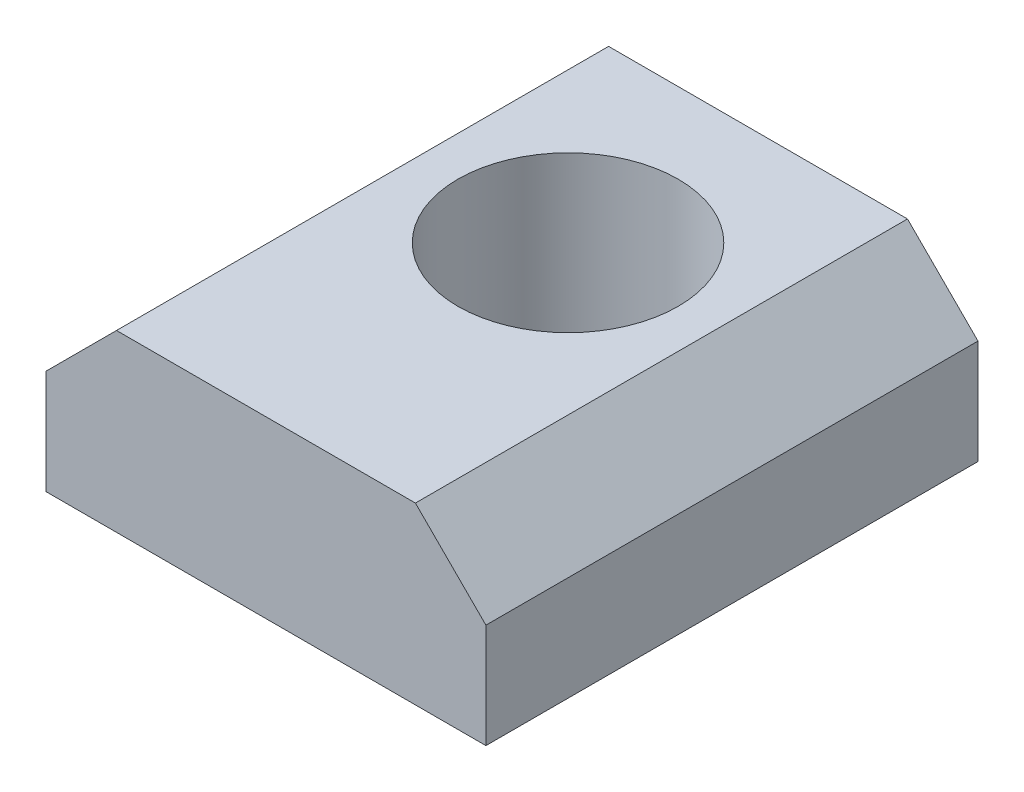
ISO-10303-21;
HEADER;
FILE_DESCRIPTION(('STEP AP214'),'2;1');
FILE_NAME('part.step','',(''),(''),'','','');
FILE_SCHEMA(('AUTOMOTIVE_DESIGN { 1 0 10303 214 1 1 1 1 }'));
ENDSEC;
DATA;
#1=APPLICATION_CONTEXT('core data for automotive mechanical design processes');
#2=APPLICATION_PROTOCOL_DEFINITION('international standard','automotive_design',2000,#1);
#3=PRODUCT_CONTEXT('',#1,'mechanical');
#4=PRODUCT('Part','Part','',(#3));
#5=PRODUCT_RELATED_PRODUCT_CATEGORY('part','',(#4));
#6=PRODUCT_DEFINITION_FORMATION('','',#4);
#7=PRODUCT_DEFINITION_CONTEXT('part definition',#1,'design');
#8=PRODUCT_DEFINITION('design','',#6,#7);
#9=PRODUCT_DEFINITION_SHAPE('','',#8);
#10=(LENGTH_UNIT() NAMED_UNIT(*) SI_UNIT(.MILLI.,.METRE.));
#11=(NAMED_UNIT(*) PLANE_ANGLE_UNIT() SI_UNIT($,.RADIAN.));
#12=(NAMED_UNIT(*) SI_UNIT($,.STERADIAN.) SOLID_ANGLE_UNIT());
#13=UNCERTAINTY_MEASURE_WITH_UNIT(LENGTH_MEASURE(1.E-05),#10,'distance_accuracy_value','');
#14=(GEOMETRIC_REPRESENTATION_CONTEXT(3) GLOBAL_UNCERTAINTY_ASSIGNED_CONTEXT((#13)) GLOBAL_UNIT_ASSIGNED_CONTEXT((#10,
#11,#12)) REPRESENTATION_CONTEXT('',''));
#15=CARTESIAN_POINT('',(0.,0.,0.));
#16=DIRECTION('',(0.,0.,1.));
#17=DIRECTION('',(1.,0.,0.));
#18=AXIS2_PLACEMENT_3D('',#15,#16,#17);
#19=CARTESIAN_POINT('',(0.,0.,-17.7292));
#20=DIRECTION('',(0.,-1.,0.));
#21=DIRECTION('',(0.,0.,-1.));
#22=AXIS2_PLACEMENT_3D('',#19,#20,#21);
#23=PLANE('',#22);
#24=CARTESIAN_POINT('',(7.9375,0.,-10.8712));
#25=DIRECTION('',(0.,-1.,0.));
#26=DIRECTION('',(0.,0.,-1.));
#27=AXIS2_PLACEMENT_3D('',#24,#25,#26);
#28=CIRCLE('',#27,3.96875);
#29=CARTESIAN_POINT('',(7.9375,0.,-14.83995));
#30=VERTEX_POINT('',#29);
#31=EDGE_CURVE('E90',#30,#30,#28,.T.);
#32=ORIENTED_EDGE('',*,*,#31,.F.);
#33=EDGE_LOOP('',(#32));
#34=FACE_BOUND('',#33,.T.);
#35=DIRECTION('',(1.,0.,0.));
#36=VECTOR('',#35,1.);
#37=CARTESIAN_POINT('',(0.,0.,0.));
#38=LINE('',#37,#36);
#39=CARTESIAN_POINT('',(0.,0.,0.));
#40=VERTEX_POINT('',#39);
#41=CARTESIAN_POINT('',(15.8496,0.,0.));
#42=VERTEX_POINT('',#41);
#43=EDGE_CURVE('E87',#40,#42,#38,.T.);
#44=ORIENTED_EDGE('',*,*,#43,.F.);
#45=DIRECTION('',(0.,0.,1.));
#46=VECTOR('',#45,1.);
#47=CARTESIAN_POINT('',(0.,0.,-17.7292));
#48=LINE('',#47,#46);
#49=CARTESIAN_POINT('',(0.,0.,-17.7292));
#50=VERTEX_POINT('',#49);
#51=EDGE_CURVE('E93',#50,#40,#48,.T.);
#52=ORIENTED_EDGE('',*,*,#51,.F.);
#53=DIRECTION('',(1.,0.,0.));
#54=VECTOR('',#53,1.);
#55=CARTESIAN_POINT('',(0.,0.,-17.7292));
#56=LINE('',#55,#54);
#57=CARTESIAN_POINT('',(15.8496,0.,-17.7292));
#58=VERTEX_POINT('',#57);
#59=EDGE_CURVE('E110',#50,#58,#56,.T.);
#60=ORIENTED_EDGE('',*,*,#59,.T.);
#61=DIRECTION('',(0.,0.,1.));
#62=VECTOR('',#61,1.);
#63=CARTESIAN_POINT('',(15.8496,0.,-17.7292));
#64=LINE('',#63,#62);
#65=EDGE_CURVE('E98',#58,#42,#64,.T.);
#66=ORIENTED_EDGE('',*,*,#65,.T.);
#67=EDGE_LOOP('',(#44,#52,#60,#66));
#68=FACE_BOUND('',#67,.T.);
#69=ADVANCED_FACE('F30',(#34,#68),#23,.T.);
#70=CARTESIAN_POINT('',(0.,0.,-17.7292));
#71=DIRECTION('',(-1.,0.,0.));
#72=DIRECTION('',(0.,0.,1.));
#73=AXIS2_PLACEMENT_3D('',#70,#71,#72);
#74=PLANE('',#73);
#75=DIRECTION('',(0.,-1.,0.));
#76=VECTOR('',#75,1.);
#77=CARTESIAN_POINT('',(0.,0.,0.));
#78=LINE('',#77,#76);
#79=CARTESIAN_POINT('',(0.,3.75919999999999,0.));
#80=VERTEX_POINT('',#79);
#81=EDGE_CURVE('E82',#80,#40,#78,.T.);
#82=ORIENTED_EDGE('',*,*,#81,.F.);
#83=DIRECTION('',(0.,0.,-1.));
#84=VECTOR('',#83,1.);
#85=CARTESIAN_POINT('',(0.,3.75919999999999,-17.7292));
#86=LINE('',#85,#84);
#87=CARTESIAN_POINT('',(0.,3.75919999999999,-17.7292));
#88=VERTEX_POINT('',#87);
#89=EDGE_CURVE('E11',#80,#88,#86,.T.);
#90=ORIENTED_EDGE('',*,*,#89,.T.);
#91=DIRECTION('',(0.,-1.,0.));
#92=VECTOR('',#91,1.);
#93=CARTESIAN_POINT('',(0.,0.,-17.7292));
#94=LINE('',#93,#92);
#95=EDGE_CURVE('E94',#88,#50,#94,.T.);
#96=ORIENTED_EDGE('',*,*,#95,.T.);
#97=ORIENTED_EDGE('',*,*,#51,.T.);
#98=EDGE_LOOP('',(#82,#90,#96,#97));
#99=FACE_BOUND('',#98,.T.);
#100=ADVANCED_FACE('F32',(#99),#74,.T.);
#101=CARTESIAN_POINT('',(0.,6.2992,-17.7292));
#102=DIRECTION('',(0.,1.,0.));
#103=DIRECTION('',(0.,0.,1.));
#104=AXIS2_PLACEMENT_3D('',#101,#102,#103);
#105=PLANE('',#104);
#106=CARTESIAN_POINT('',(7.9375,6.2992,-10.8712));
#107=DIRECTION('',(0.,1.,0.));
#108=DIRECTION('',(0.,0.,1.));
#109=AXIS2_PLACEMENT_3D('',#106,#107,#108);
#110=CIRCLE('',#109,3.96875);
#111=CARTESIAN_POINT('',(7.9375,6.2992,-6.90245));
#112=VERTEX_POINT('',#111);
#113=EDGE_CURVE('E120',#112,#112,#110,.T.);
#114=ORIENTED_EDGE('',*,*,#113,.F.);
#115=EDGE_LOOP('',(#114));
#116=FACE_BOUND('',#115,.T.);
#117=DIRECTION('',(-1.,0.,0.));
#118=VECTOR('',#117,1.);
#119=CARTESIAN_POINT('',(0.,6.2992,0.));
#120=LINE('',#119,#118);
#121=CARTESIAN_POINT('',(13.3096,6.2992,0.));
#122=VERTEX_POINT('',#121);
#123=CARTESIAN_POINT('',(2.54,6.2992,0.));
#124=VERTEX_POINT('',#123);
#125=EDGE_CURVE('E104',#122,#124,#120,.T.);
#126=ORIENTED_EDGE('',*,*,#125,.F.);
#127=DIRECTION('',(0.,0.,-1.));
#128=VECTOR('',#127,1.);
#129=CARTESIAN_POINT('',(13.3096,6.2992,-17.7292));
#130=LINE('',#129,#128);
#131=CARTESIAN_POINT('',(13.3096,6.2992,-17.7292));
#132=VERTEX_POINT('',#131);
#133=EDGE_CURVE('E129',#122,#132,#130,.T.);
#134=ORIENTED_EDGE('',*,*,#133,.T.);
#135=DIRECTION('',(-1.,0.,0.));
#136=VECTOR('',#135,1.);
#137=CARTESIAN_POINT('',(0.,6.2992,-17.7292));
#138=LINE('',#137,#136);
#139=CARTESIAN_POINT('',(2.54,6.2992,-17.7292));
#140=VERTEX_POINT('',#139);
#141=EDGE_CURVE('E99',#132,#140,#138,.T.);
#142=ORIENTED_EDGE('',*,*,#141,.T.);
#143=DIRECTION('',(0.,0.,1.));
#144=VECTOR('',#143,1.);
#145=CARTESIAN_POINT('',(2.54,6.2992,-17.7292));
#146=LINE('',#145,#144);
#147=EDGE_CURVE('E126',#140,#124,#146,.T.);
#148=ORIENTED_EDGE('',*,*,#147,.T.);
#149=EDGE_LOOP('',(#126,#134,#142,#148));
#150=FACE_BOUND('',#149,.T.);
#151=ADVANCED_FACE('F142',(#116,#150),#105,.T.);
#152=CARTESIAN_POINT('',(15.8496,0.,-17.7292));
#153=DIRECTION('',(1.,0.,0.));
#154=DIRECTION('',(0.,0.,-1.));
#155=AXIS2_PLACEMENT_3D('',#152,#153,#154);
#156=PLANE('',#155);
#157=DIRECTION('',(0.,1.,0.));
#158=VECTOR('',#157,1.);
#159=CARTESIAN_POINT('',(15.8496,0.,-17.7292));
#160=LINE('',#159,#158);
#161=CARTESIAN_POINT('',(15.8496,3.7592,-17.7292));
#162=VERTEX_POINT('',#161);
#163=EDGE_CURVE('E112',#58,#162,#160,.T.);
#164=ORIENTED_EDGE('',*,*,#163,.T.);
#165=DIRECTION('',(0.,0.,1.));
#166=VECTOR('',#165,1.);
#167=CARTESIAN_POINT('',(15.8496,3.7592,-17.7292));
#168=LINE('',#167,#166);
#169=CARTESIAN_POINT('',(15.8496,3.7592,0.));
#170=VERTEX_POINT('',#169);
#171=EDGE_CURVE('E116',#162,#170,#168,.T.);
#172=ORIENTED_EDGE('',*,*,#171,.T.);
#173=DIRECTION('',(0.,1.,0.));
#174=VECTOR('',#173,1.);
#175=CARTESIAN_POINT('',(15.8496,0.,0.));
#176=LINE('',#175,#174);
#177=EDGE_CURVE('E102',#42,#170,#176,.T.);
#178=ORIENTED_EDGE('',*,*,#177,.F.);
#179=ORIENTED_EDGE('',*,*,#65,.F.);
#180=EDGE_LOOP('',(#164,#172,#178,#179));
#181=FACE_BOUND('',#180,.T.);
#182=ADVANCED_FACE('F138',(#181),#156,.T.);
#183=CARTESIAN_POINT('',(0.,6.2992,-17.7292));
#184=DIRECTION('',(0.,0.,-1.));
#185=DIRECTION('',(-1.,0.,0.));
#186=AXIS2_PLACEMENT_3D('',#183,#184,#185);
#187=PLANE('',#186);
#188=ORIENTED_EDGE('',*,*,#141,.F.);
#189=DIRECTION('',(-0.707106781186549,0.707106781186546,0.));
#190=VECTOR('',#189,1.);
#191=CARTESIAN_POINT('',(6.65479999999997,12.954,-17.7292));
#192=LINE('',#191,#190);
#193=EDGE_CURVE('E38',#132,#162,#192,.F.);
#194=ORIENTED_EDGE('',*,*,#193,.T.);
#195=ORIENTED_EDGE('',*,*,#163,.F.);
#196=ORIENTED_EDGE('',*,*,#59,.F.);
#197=ORIENTED_EDGE('',*,*,#95,.F.);
#198=DIRECTION('',(-0.707106781186546,-0.707106781186549,0.));
#199=VECTOR('',#198,1.);
#200=CARTESIAN_POINT('',(1.27,5.0292,-17.7292));
#201=LINE('',#200,#199);
#202=EDGE_CURVE('E50',#88,#140,#201,.F.);
#203=ORIENTED_EDGE('',*,*,#202,.T.);
#204=EDGE_LOOP('',(#188,#194,#195,#196,#197,#203));
#205=FACE_BOUND('',#204,.T.);
#206=ADVANCED_FACE('F133',(#205),#187,.T.);
#207=CARTESIAN_POINT('',(0.,6.2992,0.));
#208=DIRECTION('',(0.,0.,-1.));
#209=DIRECTION('',(-1.,0.,0.));
#210=AXIS2_PLACEMENT_3D('',#207,#208,#209);
#211=PLANE('',#210);
#212=ORIENTED_EDGE('',*,*,#177,.T.);
#213=DIRECTION('',(0.707106781186549,-0.707106781186546,0.));
#214=VECTOR('',#213,1.);
#215=CARTESIAN_POINT('',(15.8496,3.7592,0.));
#216=LINE('',#215,#214);
#217=EDGE_CURVE('E124',#170,#122,#216,.F.);
#218=ORIENTED_EDGE('',*,*,#217,.T.);
#219=ORIENTED_EDGE('',*,*,#125,.T.);
#220=DIRECTION('',(0.707106781186546,0.707106781186549,0.));
#221=VECTOR('',#220,1.);
#222=CARTESIAN_POINT('',(2.54,6.2992,0.));
#223=LINE('',#222,#221);
#224=EDGE_CURVE('E89',#124,#80,#223,.F.);
#225=ORIENTED_EDGE('',*,*,#224,.T.);
#226=ORIENTED_EDGE('',*,*,#81,.T.);
#227=ORIENTED_EDGE('',*,*,#43,.T.);
#228=EDGE_LOOP('',(#212,#218,#219,#225,#226,#227));
#229=FACE_BOUND('',#228,.T.);
#230=ADVANCED_FACE('F85',(#229),#211,.F.);
#231=CARTESIAN_POINT('',(7.9375,6.2992,-10.8712));
#232=DIRECTION('',(0.,1.,0.));
#233=DIRECTION('',(0.,0.,1.));
#234=AXIS2_PLACEMENT_3D('',#231,#232,#233);
#235=CYLINDRICAL_SURFACE('',#234,3.96875);
#236=ORIENTED_EDGE('',*,*,#31,.T.);
#237=EDGE_LOOP('',(#236));
#238=FACE_BOUND('',#237,.T.);
#239=ORIENTED_EDGE('',*,*,#113,.T.);
#240=EDGE_LOOP('',(#239));
#241=FACE_BOUND('',#240,.T.);
#242=ADVANCED_FACE('F151',(#238,#241),#235,.F.);
#243=CARTESIAN_POINT('',(15.8496,3.7592,-17.7292));
#244=DIRECTION('',(-0.707106781186546,-0.707106781186549,0.));
#245=DIRECTION('',(0.707106781186549,-0.707106781186546,0.));
#246=AXIS2_PLACEMENT_3D('',#243,#244,#245);
#247=PLANE('',#246);
#248=ORIENTED_EDGE('',*,*,#193,.F.);
#249=ORIENTED_EDGE('',*,*,#133,.F.);
#250=ORIENTED_EDGE('',*,*,#217,.F.);
#251=ORIENTED_EDGE('',*,*,#171,.F.);
#252=EDGE_LOOP('',(#248,#249,#250,#251));
#253=FACE_BOUND('',#252,.T.);
#254=ADVANCED_FACE('F139',(#253),#247,.F.);
#255=CARTESIAN_POINT('',(2.54,6.2992,-17.7292));
#256=DIRECTION('',(0.707106781186549,-0.707106781186546,0.));
#257=DIRECTION('',(0.707106781186546,0.707106781186549,0.));
#258=AXIS2_PLACEMENT_3D('',#255,#256,#257);
#259=PLANE('',#258);
#260=ORIENTED_EDGE('',*,*,#202,.F.);
#261=ORIENTED_EDGE('',*,*,#89,.F.);
#262=ORIENTED_EDGE('',*,*,#224,.F.);
#263=ORIENTED_EDGE('',*,*,#147,.F.);
#264=EDGE_LOOP('',(#260,#261,#262,#263));
#265=FACE_BOUND('',#264,.T.);
#266=ADVANCED_FACE('F145',(#265),#259,.F.);
#267=CLOSED_SHELL('',(#69,#100,#151,#182,#206,#230,#242,#254,#266));
#268=MANIFOLD_SOLID_BREP('B2',#267);
#269=ADVANCED_BREP_SHAPE_REPRESENTATION('',(#18,#268),#14);
#270=SHAPE_DEFINITION_REPRESENTATION(#9,#269);
ENDSEC;
END-ISO-10303-21;
